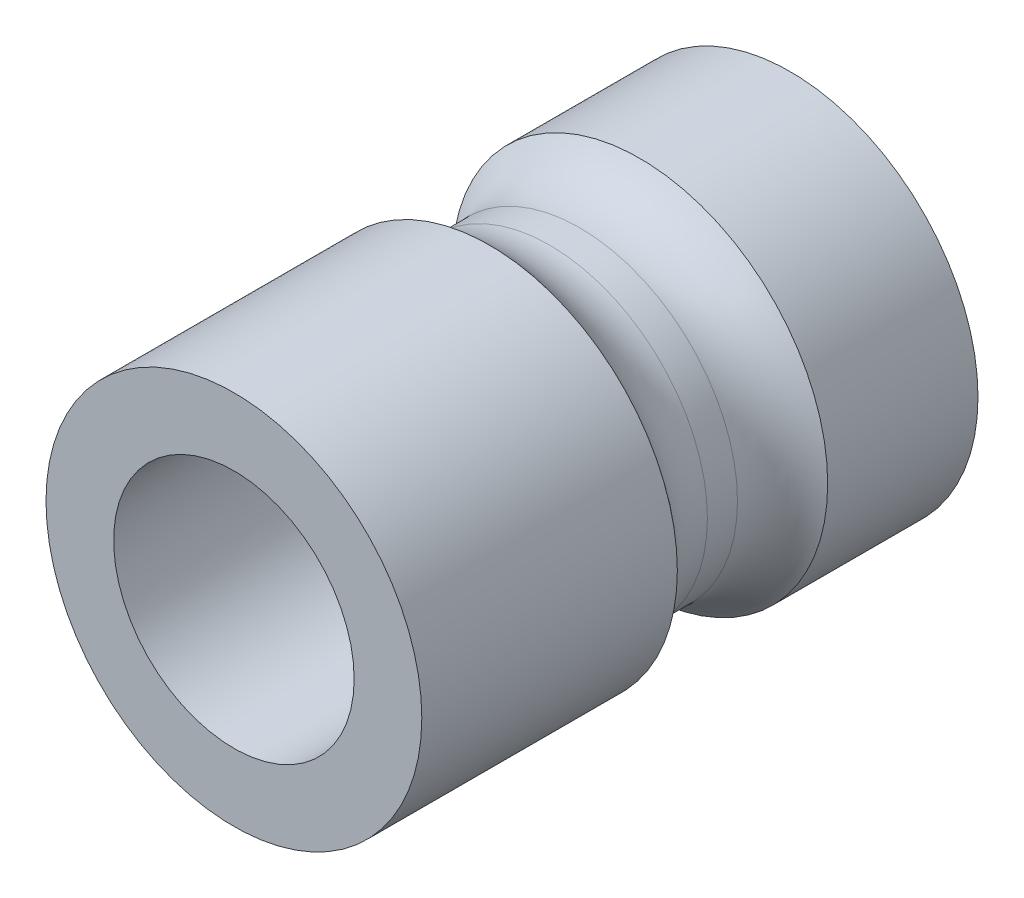
ISO-10303-21;
HEADER;
FILE_DESCRIPTION(('STEP AP214'),'2;1');
FILE_NAME('part.step','',(''),(''),'','','');
FILE_SCHEMA(('AUTOMOTIVE_DESIGN { 1 0 10303 214 1 1 1 1 }'));
ENDSEC;
DATA;
#1=APPLICATION_CONTEXT('core data for automotive mechanical design processes');
#2=APPLICATION_PROTOCOL_DEFINITION('international standard','automotive_design',2000,#1);
#3=PRODUCT_CONTEXT('',#1,'mechanical');
#4=PRODUCT('Part','Part','',(#3));
#5=PRODUCT_RELATED_PRODUCT_CATEGORY('part','',(#4));
#6=PRODUCT_DEFINITION_FORMATION('','',#4);
#7=PRODUCT_DEFINITION_CONTEXT('part definition',#1,'design');
#8=PRODUCT_DEFINITION('design','',#6,#7);
#9=PRODUCT_DEFINITION_SHAPE('','',#8);
#10=(LENGTH_UNIT() NAMED_UNIT(*) SI_UNIT(.MILLI.,.METRE.));
#11=(NAMED_UNIT(*) PLANE_ANGLE_UNIT() SI_UNIT($,.RADIAN.));
#12=(NAMED_UNIT(*) SI_UNIT($,.STERADIAN.) SOLID_ANGLE_UNIT());
#13=UNCERTAINTY_MEASURE_WITH_UNIT(LENGTH_MEASURE(1.E-05),#10,'distance_accuracy_value','');
#14=(GEOMETRIC_REPRESENTATION_CONTEXT(3) GLOBAL_UNCERTAINTY_ASSIGNED_CONTEXT((#13)) GLOBAL_UNIT_ASSIGNED_CONTEXT((#10,
#11,#12)) REPRESENTATION_CONTEXT('',''));
#15=CARTESIAN_POINT('',(0.,0.,0.));
#16=DIRECTION('',(0.,0.,1.));
#17=DIRECTION('',(1.,0.,0.));
#18=AXIS2_PLACEMENT_3D('',#15,#16,#17);
#19=CARTESIAN_POINT('',(0.,0.,2.));
#20=DIRECTION('',(0.,0.,-1.));
#21=DIRECTION('',(-1.,0.,0.));
#22=AXIS2_PLACEMENT_3D('',#19,#20,#21);
#23=CYLINDRICAL_SURFACE('',#22,2.5);
#24=CARTESIAN_POINT('',(0.,0.,2.));
#25=DIRECTION('',(0.,0.,1.));
#26=DIRECTION('',(1.,0.,0.));
#27=AXIS2_PLACEMENT_3D('',#24,#25,#26);
#28=CIRCLE('',#27,2.5);
#29=CARTESIAN_POINT('',(2.5,0.,2.));
#30=VERTEX_POINT('',#29);
#31=EDGE_CURVE('E44',#30,#30,#28,.T.);
#32=ORIENTED_EDGE('',*,*,#31,.F.);
#33=EDGE_LOOP('',(#32));
#34=FACE_BOUND('',#33,.T.);
#35=CARTESIAN_POINT('',(0.,0.,0.));
#36=DIRECTION('',(0.,0.,1.));
#37=DIRECTION('',(1.,0.,0.));
#38=AXIS2_PLACEMENT_3D('',#35,#36,#37);
#39=CIRCLE('',#38,2.5);
#40=CARTESIAN_POINT('',(2.5,0.,0.));
#41=VERTEX_POINT('',#40);
#42=EDGE_CURVE('E48',#41,#41,#39,.T.);
#43=ORIENTED_EDGE('',*,*,#42,.T.);
#44=EDGE_LOOP('',(#43));
#45=FACE_BOUND('',#44,.T.);
#46=ADVANCED_FACE('F33',(#34,#45),#23,.T.);
#47=CARTESIAN_POINT('',(0.,0.,0.));
#48=DIRECTION('',(0.,0.,1.));
#49=DIRECTION('',(1.,0.,0.));
#50=AXIS2_PLACEMENT_3D('',#47,#48,#49);
#51=PLANE('',#50);
#52=CARTESIAN_POINT('',(0.,0.,0.));
#53=DIRECTION('',(0.,0.,1.));
#54=DIRECTION('',(1.,0.,0.));
#55=AXIS2_PLACEMENT_3D('',#52,#53,#54);
#56=CIRCLE('',#55,1.6);
#57=CARTESIAN_POINT('',(1.6,0.,0.));
#58=VERTEX_POINT('',#57);
#59=EDGE_CURVE('E57',#58,#58,#56,.T.);
#60=ORIENTED_EDGE('',*,*,#59,.T.);
#61=EDGE_LOOP('',(#60));
#62=FACE_BOUND('',#61,.T.);
#63=ORIENTED_EDGE('',*,*,#42,.F.);
#64=EDGE_LOOP('',(#63));
#65=FACE_BOUND('',#64,.T.);
#66=ADVANCED_FACE('F66',(#62,#65),#51,.F.);
#67=CARTESIAN_POINT('',(0.,0.,4.));
#68=DIRECTION('',(0.,0.,-1.));
#69=DIRECTION('',(-1.,0.,0.));
#70=AXIS2_PLACEMENT_3D('',#67,#68,#69);
#71=CYLINDRICAL_SURFACE('',#70,2.1);
#72=CARTESIAN_POINT('',(0.,0.,3.2));
#73=DIRECTION('',(0.,0.,1.));
#74=DIRECTION('',(1.,0.,0.));
#75=AXIS2_PLACEMENT_3D('',#72,#73,#74);
#76=CIRCLE('',#75,2.1);
#77=CARTESIAN_POINT('',(2.1,0.,3.2));
#78=VERTEX_POINT('',#77);
#79=EDGE_CURVE('E10',#78,#78,#76,.F.);
#80=ORIENTED_EDGE('',*,*,#79,.T.);
#81=EDGE_LOOP('',(#80));
#82=FACE_BOUND('',#81,.T.);
#83=CARTESIAN_POINT('',(0.,0.,2.8));
#84=DIRECTION('',(0.,0.,-1.));
#85=DIRECTION('',(-1.,0.,0.));
#86=AXIS2_PLACEMENT_3D('',#83,#84,#85);
#87=CIRCLE('',#86,2.1);
#88=CARTESIAN_POINT('',(-2.1,0.,2.8));
#89=VERTEX_POINT('',#88);
#90=EDGE_CURVE('E40',#89,#89,#87,.F.);
#91=ORIENTED_EDGE('',*,*,#90,.T.);
#92=EDGE_LOOP('',(#91));
#93=FACE_BOUND('',#92,.T.);
#94=ADVANCED_FACE('F85',(#82,#93),#71,.T.);
#95=CARTESIAN_POINT('',(0.,0.,7.4));
#96=DIRECTION('',(0.,0.,-1.));
#97=DIRECTION('',(-1.,0.,0.));
#98=AXIS2_PLACEMENT_3D('',#95,#96,#97);
#99=CYLINDRICAL_SURFACE('',#98,2.5);
#100=CARTESIAN_POINT('',(0.,0.,7.4));
#101=DIRECTION('',(0.,0.,1.));
#102=DIRECTION('',(1.,0.,0.));
#103=AXIS2_PLACEMENT_3D('',#100,#101,#102);
#104=CIRCLE('',#103,2.5);
#105=CARTESIAN_POINT('',(2.5,0.,7.4));
#106=VERTEX_POINT('',#105);
#107=EDGE_CURVE('E52',#106,#106,#104,.T.);
#108=ORIENTED_EDGE('',*,*,#107,.F.);
#109=EDGE_LOOP('',(#108));
#110=FACE_BOUND('',#109,.T.);
#111=CARTESIAN_POINT('',(0.,0.,4.));
#112=DIRECTION('',(0.,0.,1.));
#113=DIRECTION('',(1.,0.,0.));
#114=AXIS2_PLACEMENT_3D('',#111,#112,#113);
#115=CIRCLE('',#114,2.5);
#116=CARTESIAN_POINT('',(2.5,0.,4.));
#117=VERTEX_POINT('',#116);
#118=EDGE_CURVE('E54',#117,#117,#115,.T.);
#119=ORIENTED_EDGE('',*,*,#118,.T.);
#120=EDGE_LOOP('',(#119));
#121=FACE_BOUND('',#120,.T.);
#122=ADVANCED_FACE('F79',(#110,#121),#99,.T.);
#123=CARTESIAN_POINT('',(0.,0.,7.4));
#124=DIRECTION('',(0.,0.,1.));
#125=DIRECTION('',(1.,0.,0.));
#126=AXIS2_PLACEMENT_3D('',#123,#124,#125);
#127=PLANE('',#126);
#128=CARTESIAN_POINT('',(0.,0.,7.4));
#129=DIRECTION('',(0.,0.,1.));
#130=DIRECTION('',(1.,0.,0.));
#131=AXIS2_PLACEMENT_3D('',#128,#129,#130);
#132=CIRCLE('',#131,1.6);
#133=CARTESIAN_POINT('',(1.6,0.,7.4));
#134=VERTEX_POINT('',#133);
#135=EDGE_CURVE('E60',#134,#134,#132,.T.);
#136=ORIENTED_EDGE('',*,*,#135,.F.);
#137=EDGE_LOOP('',(#136));
#138=FACE_BOUND('',#137,.T.);
#139=ORIENTED_EDGE('',*,*,#107,.T.);
#140=EDGE_LOOP('',(#139));
#141=FACE_BOUND('',#140,.T.);
#142=ADVANCED_FACE('F73',(#138,#141),#127,.T.);
#143=CARTESIAN_POINT('',(0.,0.,0.));
#144=DIRECTION('',(0.,0.,1.));
#145=DIRECTION('',(1.,0.,0.));
#146=AXIS2_PLACEMENT_3D('',#143,#144,#145);
#147=CYLINDRICAL_SURFACE('',#146,1.6);
#148=ORIENTED_EDGE('',*,*,#59,.F.);
#149=EDGE_LOOP('',(#148));
#150=FACE_BOUND('',#149,.T.);
#151=ORIENTED_EDGE('',*,*,#135,.T.);
#152=EDGE_LOOP('',(#151));
#153=FACE_BOUND('',#152,.T.);
#154=ADVANCED_FACE('F69',(#150,#153),#147,.F.);
#155=CARTESIAN_POINT('',(0.,0.,3.2));
#156=DIRECTION('',(0.,0.,1.));
#157=DIRECTION('',(1.,0.,0.));
#158=AXIS2_PLACEMENT_3D('',#155,#156,#157);
#159=TOROIDAL_SURFACE('',#158,3.1,1.);
#160=ORIENTED_EDGE('',*,*,#79,.F.);
#161=EDGE_LOOP('',(#160));
#162=FACE_BOUND('',#161,.T.);
#163=ORIENTED_EDGE('',*,*,#118,.F.);
#164=EDGE_LOOP('',(#163));
#165=FACE_BOUND('',#164,.T.);
#166=ADVANCED_FACE('F72',(#162,#165),#159,.F.);
#167=CARTESIAN_POINT('',(0.,0.,2.8));
#168=DIRECTION('',(0.,0.,-1.));
#169=DIRECTION('',(-1.,0.,0.));
#170=AXIS2_PLACEMENT_3D('',#167,#168,#169);
#171=TOROIDAL_SURFACE('',#170,3.1,1.);
#172=ORIENTED_EDGE('',*,*,#31,.T.);
#173=EDGE_LOOP('',(#172));
#174=FACE_BOUND('',#173,.T.);
#175=ORIENTED_EDGE('',*,*,#90,.F.);
#176=EDGE_LOOP('',(#175));
#177=FACE_BOUND('',#176,.T.);
#178=ADVANCED_FACE('F35',(#174,#177),#171,.F.);
#179=CLOSED_SHELL('',(#46,#66,#94,#122,#142,#154,#166,#178));
#180=MANIFOLD_SOLID_BREP('B2',#179);
#181=ADVANCED_BREP_SHAPE_REPRESENTATION('',(#18,#180),#14);
#182=SHAPE_DEFINITION_REPRESENTATION(#9,#181);
ENDSEC;
END-ISO-10303-21;
